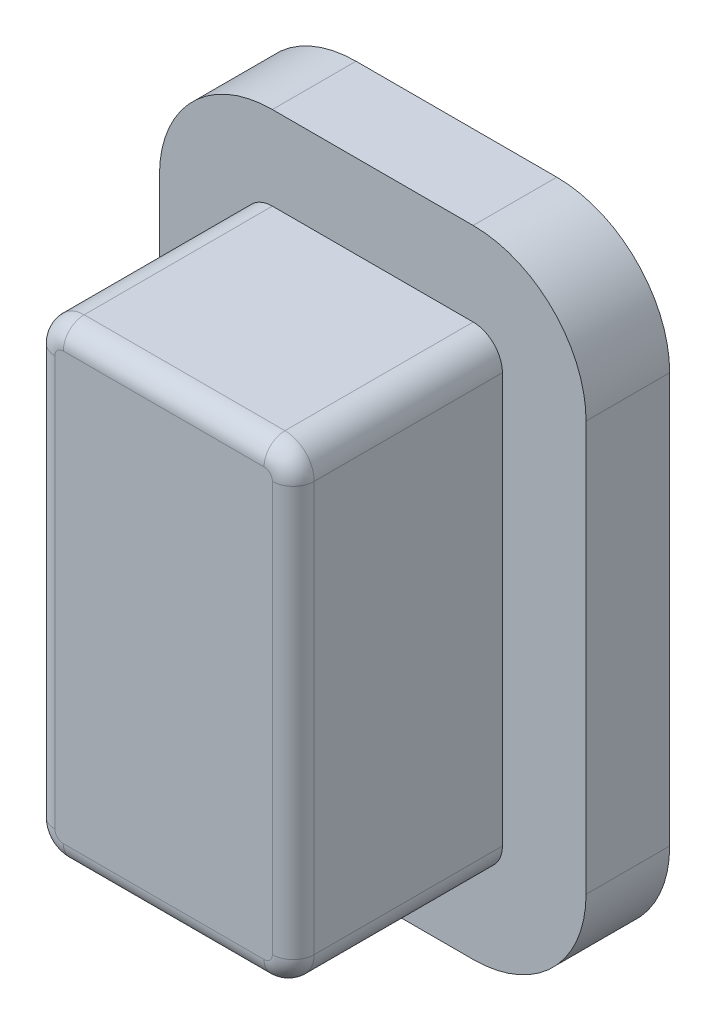
ISO-10303-21;
HEADER;
FILE_DESCRIPTION(('STEP AP214'),'2;1');
FILE_NAME('part.step','',(''),(''),'','','');
FILE_SCHEMA(('AUTOMOTIVE_DESIGN { 1 0 10303 214 1 1 1 1 }'));
ENDSEC;
DATA;
#1=APPLICATION_CONTEXT('core data for automotive mechanical design processes');
#2=APPLICATION_PROTOCOL_DEFINITION('international standard','automotive_design',2000,#1);
#3=PRODUCT_CONTEXT('',#1,'mechanical');
#4=PRODUCT('Part','Part','',(#3));
#5=PRODUCT_RELATED_PRODUCT_CATEGORY('part','',(#4));
#6=PRODUCT_DEFINITION_FORMATION('','',#4);
#7=PRODUCT_DEFINITION_CONTEXT('part definition',#1,'design');
#8=PRODUCT_DEFINITION('design','',#6,#7);
#9=PRODUCT_DEFINITION_SHAPE('','',#8);
#10=(LENGTH_UNIT() NAMED_UNIT(*) SI_UNIT(.MILLI.,.METRE.));
#11=(NAMED_UNIT(*) PLANE_ANGLE_UNIT() SI_UNIT($,.RADIAN.));
#12=(NAMED_UNIT(*) SI_UNIT($,.STERADIAN.) SOLID_ANGLE_UNIT());
#13=UNCERTAINTY_MEASURE_WITH_UNIT(LENGTH_MEASURE(1.E-05),#10,'distance_accuracy_value','');
#14=(GEOMETRIC_REPRESENTATION_CONTEXT(3) GLOBAL_UNCERTAINTY_ASSIGNED_CONTEXT((#13)) GLOBAL_UNIT_ASSIGNED_CONTEXT((#10,
#11,#12)) REPRESENTATION_CONTEXT('',''));
#15=CARTESIAN_POINT('',(0.,0.,0.));
#16=DIRECTION('',(0.,0.,1.));
#17=DIRECTION('',(1.,0.,0.));
#18=AXIS2_PLACEMENT_3D('',#15,#16,#17);
#19=CARTESIAN_POINT('',(2.1,0.,7.));
#20=DIRECTION('',(-1.,0.,0.));
#21=DIRECTION('',(0.,0.,1.));
#22=AXIS2_PLACEMENT_3D('',#19,#20,#21);
#23=PLANE('',#22);
#24=DIRECTION('',(0.,-1.,0.));
#25=VECTOR('',#24,1.);
#26=CARTESIAN_POINT('',(2.1,0.,1.3));
#27=LINE('',#26,#25);
#28=CARTESIAN_POINT('',(2.1,3.5,1.3));
#29=VERTEX_POINT('',#28);
#30=CARTESIAN_POINT('',(2.1,-3.5,1.3));
#31=VERTEX_POINT('',#30);
#32=EDGE_CURVE('E331',#29,#31,#27,.T.);
#33=ORIENTED_EDGE('',*,*,#32,.T.);
#34=DIRECTION('',(0.,0.,-1.));
#35=VECTOR('',#34,1.);
#36=CARTESIAN_POINT('',(2.1,-3.5,7.));
#37=LINE('',#36,#35);
#38=CARTESIAN_POINT('',(2.1,-3.5,0.));
#39=VERTEX_POINT('',#38);
#40=EDGE_CURVE('E346',#31,#39,#37,.T.);
#41=ORIENTED_EDGE('',*,*,#40,.T.);
#42=DIRECTION('',(0.,1.,0.));
#43=VECTOR('',#42,1.);
#44=CARTESIAN_POINT('',(2.1,0.,0.));
#45=LINE('',#44,#43);
#46=CARTESIAN_POINT('',(2.1,-4.6,0.));
#47=VERTEX_POINT('',#46);
#48=EDGE_CURVE('E495',#47,#39,#45,.T.);
#49=ORIENTED_EDGE('',*,*,#48,.F.);
#50=DIRECTION('',(0.,0.,-1.));
#51=VECTOR('',#50,1.);
#52=CARTESIAN_POINT('',(2.1,-4.6,7.));
#53=LINE('',#52,#51);
#54=CARTESIAN_POINT('',(2.1,-4.6,6.));
#55=VERTEX_POINT('',#54);
#56=EDGE_CURVE('E525',#55,#47,#53,.T.);
#57=ORIENTED_EDGE('',*,*,#56,.F.);
#58=DIRECTION('',(0.,-1.,0.));
#59=VECTOR('',#58,1.);
#60=CARTESIAN_POINT('',(2.1,0.,6.));
#61=LINE('',#60,#59);
#62=CARTESIAN_POINT('',(2.1,4.6,6.));
#63=VERTEX_POINT('',#62);
#64=EDGE_CURVE('E368',#63,#55,#61,.T.);
#65=ORIENTED_EDGE('',*,*,#64,.F.);
#66=DIRECTION('',(0.,0.,-1.));
#67=VECTOR('',#66,1.);
#68=CARTESIAN_POINT('',(2.1,4.6,7.));
#69=LINE('',#68,#67);
#70=CARTESIAN_POINT('',(2.1,4.6,0.));
#71=VERTEX_POINT('',#70);
#72=EDGE_CURVE('E508',#63,#71,#69,.T.);
#73=ORIENTED_EDGE('',*,*,#72,.T.);
#74=CARTESIAN_POINT('',(2.1,3.5,0.));
#75=VERTEX_POINT('',#74);
#76=EDGE_CURVE('E491',#75,#71,#45,.T.);
#77=ORIENTED_EDGE('',*,*,#76,.F.);
#78=DIRECTION('',(0.,0.,-1.));
#79=VECTOR('',#78,1.);
#80=CARTESIAN_POINT('',(2.1,3.5,7.));
#81=LINE('',#80,#79);
#82=EDGE_CURVE('E345',#29,#75,#81,.T.);
#83=ORIENTED_EDGE('',*,*,#82,.F.);
#84=EDGE_LOOP('',(#33,#41,#49,#57,#65,#73,#77,#83));
#85=FACE_BOUND('',#84,.T.);
#86=ADVANCED_FACE('F63',(#85),#23,.T.);
#87=CARTESIAN_POINT('',(-2.1,0.,7.));
#88=DIRECTION('',(-1.,0.,0.));
#89=DIRECTION('',(0.,0.,1.));
#90=AXIS2_PLACEMENT_3D('',#87,#88,#89);
#91=PLANE('',#90);
#92=DIRECTION('',(0.,0.,-1.));
#93=VECTOR('',#92,1.);
#94=CARTESIAN_POINT('',(-2.1,-3.5,7.));
#95=LINE('',#94,#93);
#96=CARTESIAN_POINT('',(-2.1,-3.5,1.3));
#97=VERTEX_POINT('',#96);
#98=CARTESIAN_POINT('',(-2.1,-3.5,0.));
#99=VERTEX_POINT('',#98);
#100=EDGE_CURVE('E343',#97,#99,#95,.T.);
#101=ORIENTED_EDGE('',*,*,#100,.F.);
#102=DIRECTION('',(0.,-1.,0.));
#103=VECTOR('',#102,1.);
#104=CARTESIAN_POINT('',(-2.1,0.,1.3));
#105=LINE('',#104,#103);
#106=CARTESIAN_POINT('',(-2.1,3.5,1.3));
#107=VERTEX_POINT('',#106);
#108=EDGE_CURVE('E297',#107,#97,#105,.T.);
#109=ORIENTED_EDGE('',*,*,#108,.F.);
#110=DIRECTION('',(0.,0.,-1.));
#111=VECTOR('',#110,1.);
#112=CARTESIAN_POINT('',(-2.1,3.5,7.));
#113=LINE('',#112,#111);
#114=CARTESIAN_POINT('',(-2.1,3.5,0.));
#115=VERTEX_POINT('',#114);
#116=EDGE_CURVE('E337',#107,#115,#113,.T.);
#117=ORIENTED_EDGE('',*,*,#116,.T.);
#118=DIRECTION('',(0.,1.,0.));
#119=VECTOR('',#118,1.);
#120=CARTESIAN_POINT('',(-2.1,0.,0.));
#121=LINE('',#120,#119);
#122=CARTESIAN_POINT('',(-2.1,4.6,0.));
#123=VERTEX_POINT('',#122);
#124=EDGE_CURVE('E498',#115,#123,#121,.T.);
#125=ORIENTED_EDGE('',*,*,#124,.T.);
#126=DIRECTION('',(0.,0.,-1.));
#127=VECTOR('',#126,1.);
#128=CARTESIAN_POINT('',(-2.1,4.6,7.));
#129=LINE('',#128,#127);
#130=CARTESIAN_POINT('',(-2.1,4.6,6.));
#131=VERTEX_POINT('',#130);
#132=EDGE_CURVE('E514',#131,#123,#129,.T.);
#133=ORIENTED_EDGE('',*,*,#132,.F.);
#134=DIRECTION('',(0.,-1.,0.));
#135=VECTOR('',#134,1.);
#136=CARTESIAN_POINT('',(-2.1,0.,6.));
#137=LINE('',#136,#135);
#138=CARTESIAN_POINT('',(-2.1,-4.6,6.));
#139=VERTEX_POINT('',#138);
#140=EDGE_CURVE('E358',#131,#139,#137,.T.);
#141=ORIENTED_EDGE('',*,*,#140,.T.);
#142=DIRECTION('',(0.,0.,-1.));
#143=VECTOR('',#142,1.);
#144=CARTESIAN_POINT('',(-2.1,-4.6,7.));
#145=LINE('',#144,#143);
#146=CARTESIAN_POINT('',(-2.1,-4.6,0.));
#147=VERTEX_POINT('',#146);
#148=EDGE_CURVE('E520',#139,#147,#145,.T.);
#149=ORIENTED_EDGE('',*,*,#148,.T.);
#150=EDGE_CURVE('E503',#147,#99,#121,.T.);
#151=ORIENTED_EDGE('',*,*,#150,.T.);
#152=EDGE_LOOP('',(#101,#109,#117,#125,#133,#141,#149,#151));
#153=FACE_BOUND('',#152,.T.);
#154=ADVANCED_FACE('F656',(#153),#91,.F.);
#155=CARTESIAN_POINT('',(0.,-4.6,7.));
#156=DIRECTION('',(0.,-1.,0.));
#157=DIRECTION('',(0.,0.,-1.));
#158=AXIS2_PLACEMENT_3D('',#155,#156,#157);
#159=PLANE('',#158);
#160=ORIENTED_EDGE('',*,*,#148,.F.);
#161=DIRECTION('',(1.,0.,0.));
#162=VECTOR('',#161,1.);
#163=CARTESIAN_POINT('',(0.,-4.6,6.));
#164=LINE('',#163,#162);
#165=EDGE_CURVE('E361',#139,#55,#164,.T.);
#166=ORIENTED_EDGE('',*,*,#165,.T.);
#167=ORIENTED_EDGE('',*,*,#56,.T.);
#168=DIRECTION('',(-1.,0.,0.));
#169=VECTOR('',#168,1.);
#170=CARTESIAN_POINT('',(0.,-4.6,0.));
#171=LINE('',#170,#169);
#172=EDGE_CURVE('E497',#47,#147,#171,.T.);
#173=ORIENTED_EDGE('',*,*,#172,.T.);
#174=EDGE_LOOP('',(#160,#166,#167,#173));
#175=FACE_BOUND('',#174,.T.);
#176=ADVANCED_FACE('F670',(#175),#159,.F.);
#177=CARTESIAN_POINT('',(-2.4,-4.9,7.));
#178=DIRECTION('',(0.,0.,-1.));
#179=DIRECTION('',(-1.,0.,0.));
#180=AXIS2_PLACEMENT_3D('',#177,#178,#179);
#181=CYLINDRICAL_SURFACE('',#180,0.7);
#182=DIRECTION('',(0.,0.,-1.));
#183=VECTOR('',#182,1.);
#184=CARTESIAN_POINT('',(-2.4,-5.6,7.));
#185=LINE('',#184,#183);
#186=CARTESIAN_POINT('',(-2.4,-5.6,6.5));
#187=VERTEX_POINT('',#186);
#188=CARTESIAN_POINT('',(-2.4,-5.6,2.));
#189=VERTEX_POINT('',#188);
#190=EDGE_CURVE('E513',#187,#189,#185,.T.);
#191=ORIENTED_EDGE('',*,*,#190,.F.);
#192=CARTESIAN_POINT('',(-2.4,-4.9,6.5));
#193=DIRECTION('',(0.,0.,1.));
#194=DIRECTION('',(1.,0.,0.));
#195=AXIS2_PLACEMENT_3D('',#192,#193,#194);
#196=CIRCLE('',#195,0.7);
#197=CARTESIAN_POINT('',(-3.1,-4.9,6.5));
#198=VERTEX_POINT('',#197);
#199=EDGE_CURVE('E12',#187,#198,#196,.F.);
#200=ORIENTED_EDGE('',*,*,#199,.T.);
#201=DIRECTION('',(0.,0.,-1.));
#202=VECTOR('',#201,1.);
#203=CARTESIAN_POINT('',(-3.1,-4.9,7.));
#204=LINE('',#203,#202);
#205=CARTESIAN_POINT('',(-3.1,-4.9,2.));
#206=VERTEX_POINT('',#205);
#207=EDGE_CURVE('E506',#198,#206,#204,.T.);
#208=ORIENTED_EDGE('',*,*,#207,.T.);
#209=CARTESIAN_POINT('',(-2.4,-4.9,2.));
#210=DIRECTION('',(0.,0.,1.));
#211=DIRECTION('',(1.,0.,0.));
#212=AXIS2_PLACEMENT_3D('',#209,#210,#211);
#213=CIRCLE('',#212,0.7);
#214=EDGE_CURVE('E410',#189,#206,#213,.F.);
#215=ORIENTED_EDGE('',*,*,#214,.F.);
#216=EDGE_LOOP('',(#191,#200,#208,#215));
#217=FACE_BOUND('',#216,.T.);
#218=ADVANCED_FACE('F716',(#217),#181,.T.);
#219=CARTESIAN_POINT('',(0.,-5.6,7.));
#220=DIRECTION('',(0.,-1.,0.));
#221=DIRECTION('',(1.,0.,0.));
#222=AXIS2_PLACEMENT_3D('',#219,#220,#221);
#223=PLANE('',#222);
#224=DIRECTION('',(0.,0.,-1.));
#225=VECTOR('',#224,1.);
#226=CARTESIAN_POINT('',(2.4,-5.6,7.));
#227=LINE('',#226,#225);
#228=CARTESIAN_POINT('',(2.4,-5.6,6.5));
#229=VERTEX_POINT('',#228);
#230=CARTESIAN_POINT('',(2.4,-5.6,2.));
#231=VERTEX_POINT('',#230);
#232=EDGE_CURVE('E543',#229,#231,#227,.T.);
#233=ORIENTED_EDGE('',*,*,#232,.F.);
#234=DIRECTION('',(-1.,0.,0.));
#235=VECTOR('',#234,1.);
#236=CARTESIAN_POINT('',(0.,-5.6,6.5));
#237=LINE('',#236,#235);
#238=EDGE_CURVE('E72',#229,#187,#237,.T.);
#239=ORIENTED_EDGE('',*,*,#238,.T.);
#240=ORIENTED_EDGE('',*,*,#190,.T.);
#241=DIRECTION('',(-1.,0.,0.));
#242=VECTOR('',#241,1.);
#243=CARTESIAN_POINT('',(0.,-5.6,2.));
#244=LINE('',#243,#242);
#245=EDGE_CURVE('E403',#231,#189,#244,.T.);
#246=ORIENTED_EDGE('',*,*,#245,.F.);
#247=EDGE_LOOP('',(#233,#239,#240,#246));
#248=FACE_BOUND('',#247,.T.);
#249=ADVANCED_FACE('F717',(#248),#223,.T.);
#250=CARTESIAN_POINT('',(2.4,-4.9,7.));
#251=DIRECTION('',(0.,0.,-1.));
#252=DIRECTION('',(-1.,0.,0.));
#253=AXIS2_PLACEMENT_3D('',#250,#251,#252);
#254=CYLINDRICAL_SURFACE('',#253,0.700000000000001);
#255=DIRECTION('',(0.,0.,-1.));
#256=VECTOR('',#255,1.);
#257=CARTESIAN_POINT('',(3.1,-4.9,7.));
#258=LINE('',#257,#256);
#259=CARTESIAN_POINT('',(3.1,-4.9,6.5));
#260=VERTEX_POINT('',#259);
#261=CARTESIAN_POINT('',(3.1,-4.9,2.));
#262=VERTEX_POINT('',#261);
#263=EDGE_CURVE('E539',#260,#262,#258,.T.);
#264=ORIENTED_EDGE('',*,*,#263,.F.);
#265=CARTESIAN_POINT('',(2.4,-4.9,6.5));
#266=DIRECTION('',(0.,0.,1.));
#267=DIRECTION('',(1.,0.,0.));
#268=AXIS2_PLACEMENT_3D('',#265,#266,#267);
#269=CIRCLE('',#268,0.700000000000001);
#270=EDGE_CURVE('E88',#260,#229,#269,.F.);
#271=ORIENTED_EDGE('',*,*,#270,.T.);
#272=ORIENTED_EDGE('',*,*,#232,.T.);
#273=CARTESIAN_POINT('',(2.4,-4.9,2.));
#274=DIRECTION('',(0.,0.,1.));
#275=DIRECTION('',(1.,0.,0.));
#276=AXIS2_PLACEMENT_3D('',#273,#274,#275);
#277=CIRCLE('',#276,0.700000000000001);
#278=EDGE_CURVE('E433',#262,#231,#277,.F.);
#279=ORIENTED_EDGE('',*,*,#278,.F.);
#280=EDGE_LOOP('',(#264,#271,#272,#279));
#281=FACE_BOUND('',#280,.T.);
#282=ADVANCED_FACE('F715',(#281),#254,.T.);
#283=CARTESIAN_POINT('',(3.1,0.,7.));
#284=DIRECTION('',(-1.,0.,0.));
#285=DIRECTION('',(0.,0.,1.));
#286=AXIS2_PLACEMENT_3D('',#283,#284,#285);
#287=PLANE('',#286);
#288=DIRECTION('',(0.,0.,-1.));
#289=VECTOR('',#288,1.);
#290=CARTESIAN_POINT('',(3.1,4.9,7.));
#291=LINE('',#290,#289);
#292=CARTESIAN_POINT('',(3.1,4.9,6.5));
#293=VERTEX_POINT('',#292);
#294=CARTESIAN_POINT('',(3.1,4.9,2.));
#295=VERTEX_POINT('',#294);
#296=EDGE_CURVE('E540',#293,#295,#291,.T.);
#297=ORIENTED_EDGE('',*,*,#296,.F.);
#298=DIRECTION('',(0.,1.,0.));
#299=VECTOR('',#298,1.);
#300=CARTESIAN_POINT('',(3.1,-4.9,6.5));
#301=LINE('',#300,#299);
#302=EDGE_CURVE('E584',#293,#260,#301,.F.);
#303=ORIENTED_EDGE('',*,*,#302,.T.);
#304=ORIENTED_EDGE('',*,*,#263,.T.);
#305=DIRECTION('',(0.,1.,0.));
#306=VECTOR('',#305,1.);
#307=CARTESIAN_POINT('',(3.1,0.,2.));
#308=LINE('',#307,#306);
#309=EDGE_CURVE('E427',#262,#295,#308,.T.);
#310=ORIENTED_EDGE('',*,*,#309,.T.);
#311=EDGE_LOOP('',(#297,#303,#304,#310));
#312=FACE_BOUND('',#311,.T.);
#313=ADVANCED_FACE('F708',(#312),#287,.F.);
#314=CARTESIAN_POINT('',(2.4,4.9,7.));
#315=DIRECTION('',(0.,0.,-1.));
#316=DIRECTION('',(-1.,0.,0.));
#317=AXIS2_PLACEMENT_3D('',#314,#315,#316);
#318=CYLINDRICAL_SURFACE('',#317,0.700000000000001);
#319=DIRECTION('',(0.,0.,-1.));
#320=VECTOR('',#319,1.);
#321=CARTESIAN_POINT('',(2.4,5.6,7.));
#322=LINE('',#321,#320);
#323=CARTESIAN_POINT('',(2.4,5.6,6.5));
#324=VERTEX_POINT('',#323);
#325=CARTESIAN_POINT('',(2.4,5.6,2.));
#326=VERTEX_POINT('',#325);
#327=EDGE_CURVE('E534',#324,#326,#322,.T.);
#328=ORIENTED_EDGE('',*,*,#327,.F.);
#329=CARTESIAN_POINT('',(2.4,4.9,6.5));
#330=DIRECTION('',(0.,0.,1.));
#331=DIRECTION('',(1.,0.,0.));
#332=AXIS2_PLACEMENT_3D('',#329,#330,#331);
#333=CIRCLE('',#332,0.700000000000001);
#334=EDGE_CURVE('E582',#324,#293,#333,.F.);
#335=ORIENTED_EDGE('',*,*,#334,.T.);
#336=ORIENTED_EDGE('',*,*,#296,.T.);
#337=CARTESIAN_POINT('',(2.4,4.9,2.));
#338=DIRECTION('',(0.,0.,1.));
#339=DIRECTION('',(1.,0.,0.));
#340=AXIS2_PLACEMENT_3D('',#337,#338,#339);
#341=CIRCLE('',#340,0.700000000000001);
#342=EDGE_CURVE('E422',#295,#326,#341,.T.);
#343=ORIENTED_EDGE('',*,*,#342,.T.);
#344=EDGE_LOOP('',(#328,#335,#336,#343));
#345=FACE_BOUND('',#344,.T.);
#346=ADVANCED_FACE('F702',(#345),#318,.T.);
#347=CARTESIAN_POINT('',(0.,5.6,7.));
#348=DIRECTION('',(0.,-1.,0.));
#349=DIRECTION('',(1.,0.,0.));
#350=AXIS2_PLACEMENT_3D('',#347,#348,#349);
#351=PLANE('',#350);
#352=DIRECTION('',(0.,0.,-1.));
#353=VECTOR('',#352,1.);
#354=CARTESIAN_POINT('',(-2.4,5.6,7.));
#355=LINE('',#354,#353);
#356=CARTESIAN_POINT('',(-2.4,5.6,6.5));
#357=VERTEX_POINT('',#356);
#358=CARTESIAN_POINT('',(-2.4,5.6,2.));
#359=VERTEX_POINT('',#358);
#360=EDGE_CURVE('E533',#357,#359,#355,.T.);
#361=ORIENTED_EDGE('',*,*,#360,.F.);
#362=DIRECTION('',(-1.,0.,0.));
#363=VECTOR('',#362,1.);
#364=CARTESIAN_POINT('',(2.4,5.6,6.5));
#365=LINE('',#364,#363);
#366=EDGE_CURVE('E576',#357,#324,#365,.F.);
#367=ORIENTED_EDGE('',*,*,#366,.T.);
#368=ORIENTED_EDGE('',*,*,#327,.T.);
#369=DIRECTION('',(-1.,0.,0.));
#370=VECTOR('',#369,1.);
#371=CARTESIAN_POINT('',(0.,5.6,2.));
#372=LINE('',#371,#370);
#373=EDGE_CURVE('E423',#326,#359,#372,.T.);
#374=ORIENTED_EDGE('',*,*,#373,.T.);
#375=EDGE_LOOP('',(#361,#367,#368,#374));
#376=FACE_BOUND('',#375,.T.);
#377=ADVANCED_FACE('F697',(#376),#351,.F.);
#378=CARTESIAN_POINT('',(-2.4,4.9,7.));
#379=DIRECTION('',(0.,0.,-1.));
#380=DIRECTION('',(-1.,0.,0.));
#381=AXIS2_PLACEMENT_3D('',#378,#379,#380);
#382=CYLINDRICAL_SURFACE('',#381,0.700000000000001);
#383=DIRECTION('',(0.,0.,-1.));
#384=VECTOR('',#383,1.);
#385=CARTESIAN_POINT('',(-3.1,4.9,7.));
#386=LINE('',#385,#384);
#387=CARTESIAN_POINT('',(-3.1,4.9,6.5));
#388=VERTEX_POINT('',#387);
#389=CARTESIAN_POINT('',(-3.1,4.9,2.));
#390=VERTEX_POINT('',#389);
#391=EDGE_CURVE('E526',#388,#390,#386,.T.);
#392=ORIENTED_EDGE('',*,*,#391,.F.);
#393=CARTESIAN_POINT('',(-2.4,4.9,6.5));
#394=DIRECTION('',(0.,0.,1.));
#395=DIRECTION('',(1.,0.,0.));
#396=AXIS2_PLACEMENT_3D('',#393,#394,#395);
#397=CIRCLE('',#396,0.700000000000001);
#398=EDGE_CURVE('E577',#388,#357,#397,.F.);
#399=ORIENTED_EDGE('',*,*,#398,.T.);
#400=ORIENTED_EDGE('',*,*,#360,.T.);
#401=CARTESIAN_POINT('',(-2.4,4.9,2.));
#402=DIRECTION('',(0.,0.,1.));
#403=DIRECTION('',(1.,0.,0.));
#404=AXIS2_PLACEMENT_3D('',#401,#402,#403);
#405=CIRCLE('',#404,0.700000000000001);
#406=EDGE_CURVE('E417',#390,#359,#405,.F.);
#407=ORIENTED_EDGE('',*,*,#406,.F.);
#408=EDGE_LOOP('',(#392,#399,#400,#407));
#409=FACE_BOUND('',#408,.T.);
#410=ADVANCED_FACE('F698',(#409),#382,.T.);
#411=CARTESIAN_POINT('',(-3.1,0.,7.));
#412=DIRECTION('',(-1.,0.,0.));
#413=DIRECTION('',(0.,0.,1.));
#414=AXIS2_PLACEMENT_3D('',#411,#412,#413);
#415=PLANE('',#414);
#416=ORIENTED_EDGE('',*,*,#207,.F.);
#417=DIRECTION('',(0.,1.,0.));
#418=VECTOR('',#417,1.);
#419=CARTESIAN_POINT('',(-3.1,0.,6.5));
#420=LINE('',#419,#418);
#421=EDGE_CURVE('E523',#198,#388,#420,.T.);
#422=ORIENTED_EDGE('',*,*,#421,.T.);
#423=ORIENTED_EDGE('',*,*,#391,.T.);
#424=DIRECTION('',(0.,1.,0.));
#425=VECTOR('',#424,1.);
#426=CARTESIAN_POINT('',(-3.1,0.,2.));
#427=LINE('',#426,#425);
#428=EDGE_CURVE('E414',#206,#390,#427,.T.);
#429=ORIENTED_EDGE('',*,*,#428,.F.);
#430=EDGE_LOOP('',(#416,#422,#423,#429));
#431=FACE_BOUND('',#430,.T.);
#432=ADVANCED_FACE('F691',(#431),#415,.T.);
#433=CARTESIAN_POINT('',(0.,4.6,7.));
#434=DIRECTION('',(0.,-1.,0.));
#435=DIRECTION('',(1.,0.,0.));
#436=AXIS2_PLACEMENT_3D('',#433,#434,#435);
#437=PLANE('',#436);
#438=DIRECTION('',(1.,0.,0.));
#439=VECTOR('',#438,1.);
#440=CARTESIAN_POINT('',(0.,4.6,6.));
#441=LINE('',#440,#439);
#442=EDGE_CURVE('E367',#131,#63,#441,.T.);
#443=ORIENTED_EDGE('',*,*,#442,.F.);
#444=ORIENTED_EDGE('',*,*,#132,.T.);
#445=DIRECTION('',(-1.,0.,0.));
#446=VECTOR('',#445,1.);
#447=CARTESIAN_POINT('',(0.,4.6,0.));
#448=LINE('',#447,#446);
#449=EDGE_CURVE('E501',#71,#123,#448,.T.);
#450=ORIENTED_EDGE('',*,*,#449,.F.);
#451=ORIENTED_EDGE('',*,*,#72,.F.);
#452=EDGE_LOOP('',(#443,#444,#450,#451));
#453=FACE_BOUND('',#452,.T.);
#454=ADVANCED_FACE('F662',(#453),#437,.T.);
#455=CARTESIAN_POINT('',(0.,0.,7.));
#456=DIRECTION('',(0.,0.,1.));
#457=DIRECTION('',(1.,0.,0.));
#458=AXIS2_PLACEMENT_3D('',#455,#456,#457);
#459=PLANE('',#458);
#460=CARTESIAN_POINT('',(-2.4,4.9,7.));
#461=DIRECTION('',(0.,0.,1.));
#462=DIRECTION('',(1.,0.,0.));
#463=AXIS2_PLACEMENT_3D('',#460,#461,#462);
#464=CIRCLE('',#463,0.200000000000001);
#465=CARTESIAN_POINT('',(-2.4,5.1,7.));
#466=VERTEX_POINT('',#465);
#467=CARTESIAN_POINT('',(-2.6,4.9,7.));
#468=VERTEX_POINT('',#467);
#469=EDGE_CURVE('E569',#466,#468,#464,.T.);
#470=ORIENTED_EDGE('',*,*,#469,.T.);
#471=DIRECTION('',(0.,1.,0.));
#472=VECTOR('',#471,1.);
#473=CARTESIAN_POINT('',(-2.6,0.,7.));
#474=LINE('',#473,#472);
#475=CARTESIAN_POINT('',(-2.6,-4.9,7.));
#476=VERTEX_POINT('',#475);
#477=EDGE_CURVE('E574',#468,#476,#474,.F.);
#478=ORIENTED_EDGE('',*,*,#477,.T.);
#479=CARTESIAN_POINT('',(-2.4,-4.9,7.));
#480=DIRECTION('',(0.,0.,1.));
#481=DIRECTION('',(1.,0.,0.));
#482=AXIS2_PLACEMENT_3D('',#479,#480,#481);
#483=CIRCLE('',#482,0.2);
#484=CARTESIAN_POINT('',(-2.4,-5.1,7.));
#485=VERTEX_POINT('',#484);
#486=EDGE_CURVE('E552',#476,#485,#483,.T.);
#487=ORIENTED_EDGE('',*,*,#486,.T.);
#488=DIRECTION('',(-1.,0.,0.));
#489=VECTOR('',#488,1.);
#490=CARTESIAN_POINT('',(0.,-5.1,7.));
#491=LINE('',#490,#489);
#492=CARTESIAN_POINT('',(2.4,-5.1,7.));
#493=VERTEX_POINT('',#492);
#494=EDGE_CURVE('E551',#485,#493,#491,.F.);
#495=ORIENTED_EDGE('',*,*,#494,.T.);
#496=CARTESIAN_POINT('',(2.4,-4.9,7.));
#497=DIRECTION('',(0.,0.,1.));
#498=DIRECTION('',(1.,0.,0.));
#499=AXIS2_PLACEMENT_3D('',#496,#497,#498);
#500=CIRCLE('',#499,0.200000000000001);
#501=CARTESIAN_POINT('',(2.6,-4.9,7.));
#502=VERTEX_POINT('',#501);
#503=EDGE_CURVE('E559',#493,#502,#500,.T.);
#504=ORIENTED_EDGE('',*,*,#503,.T.);
#505=DIRECTION('',(0.,1.,0.));
#506=VECTOR('',#505,1.);
#507=CARTESIAN_POINT('',(2.6,4.9,7.));
#508=LINE('',#507,#506);
#509=CARTESIAN_POINT('',(2.6,4.9,7.));
#510=VERTEX_POINT('',#509);
#511=EDGE_CURVE('E556',#502,#510,#508,.T.);
#512=ORIENTED_EDGE('',*,*,#511,.T.);
#513=CARTESIAN_POINT('',(2.4,4.9,7.));
#514=DIRECTION('',(0.,0.,1.));
#515=DIRECTION('',(1.,0.,0.));
#516=AXIS2_PLACEMENT_3D('',#513,#514,#515);
#517=CIRCLE('',#516,0.200000000000001);
#518=CARTESIAN_POINT('',(2.4,5.1,7.));
#519=VERTEX_POINT('',#518);
#520=EDGE_CURVE('E564',#510,#519,#517,.T.);
#521=ORIENTED_EDGE('',*,*,#520,.T.);
#522=DIRECTION('',(-1.,0.,0.));
#523=VECTOR('',#522,1.);
#524=CARTESIAN_POINT('',(-2.4,5.1,7.));
#525=LINE('',#524,#523);
#526=EDGE_CURVE('E567',#519,#466,#525,.T.);
#527=ORIENTED_EDGE('',*,*,#526,.T.);
#528=EDGE_LOOP('',(#470,#478,#487,#495,#504,#512,#521,#527));
#529=FACE_BOUND('',#528,.T.);
#530=ADVANCED_FACE('F759',(#529),#459,.T.);
#531=CARTESIAN_POINT('',(0.,0.,0.));
#532=DIRECTION('',(0.,0.,1.));
#533=DIRECTION('',(1.,0.,0.));
#534=AXIS2_PLACEMENT_3D('',#531,#532,#533);
#535=PLANE('',#534);
#536=DIRECTION('',(0.,-1.,0.));
#537=VECTOR('',#536,1.);
#538=CARTESIAN_POINT('',(-3.5,0.,0.));
#539=LINE('',#538,#537);
#540=CARTESIAN_POINT('',(-3.5,3.5,0.));
#541=VERTEX_POINT('',#540);
#542=CARTESIAN_POINT('',(-3.5,-3.5,0.));
#543=VERTEX_POINT('',#542);
#544=EDGE_CURVE('E311',#541,#543,#539,.T.);
#545=ORIENTED_EDGE('',*,*,#544,.T.);
#546=DIRECTION('',(1.,0.,0.));
#547=VECTOR('',#546,1.);
#548=CARTESIAN_POINT('',(0.,-3.5,0.));
#549=LINE('',#548,#547);
#550=EDGE_CURVE('E295',#543,#99,#549,.T.);
#551=ORIENTED_EDGE('',*,*,#550,.T.);
#552=ORIENTED_EDGE('',*,*,#150,.F.);
#553=ORIENTED_EDGE('',*,*,#172,.F.);
#554=ORIENTED_EDGE('',*,*,#48,.T.);
#555=CARTESIAN_POINT('',(3.5,-3.5,0.));
#556=VERTEX_POINT('',#555);
#557=EDGE_CURVE('E314',#39,#556,#549,.T.);
#558=ORIENTED_EDGE('',*,*,#557,.T.);
#559=DIRECTION('',(0.,-1.,0.));
#560=VECTOR('',#559,1.);
#561=CARTESIAN_POINT('',(3.5,0.,0.));
#562=LINE('',#561,#560);
#563=CARTESIAN_POINT('',(3.5,3.5,0.));
#564=VERTEX_POINT('',#563);
#565=EDGE_CURVE('E304',#564,#556,#562,.T.);
#566=ORIENTED_EDGE('',*,*,#565,.F.);
#567=DIRECTION('',(1.,0.,0.));
#568=VECTOR('',#567,1.);
#569=CARTESIAN_POINT('',(0.,3.5,0.));
#570=LINE('',#569,#568);
#571=EDGE_CURVE('E320',#75,#564,#570,.T.);
#572=ORIENTED_EDGE('',*,*,#571,.F.);
#573=ORIENTED_EDGE('',*,*,#76,.T.);
#574=ORIENTED_EDGE('',*,*,#449,.T.);
#575=ORIENTED_EDGE('',*,*,#124,.F.);
#576=EDGE_CURVE('E318',#541,#115,#570,.T.);
#577=ORIENTED_EDGE('',*,*,#576,.F.);
#578=EDGE_LOOP('',(#545,#551,#552,#553,#554,#558,#566,#572,#573,#574,#575,#577));
#579=FACE_BOUND('',#578,.T.);
#580=CARTESIAN_POINT('',(2.4,-4.9,0.));
#581=DIRECTION('',(0.,0.,1.));
#582=DIRECTION('',(1.,0.,0.));
#583=AXIS2_PLACEMENT_3D('',#580,#581,#582);
#584=CIRCLE('',#583,2.7);
#585=CARTESIAN_POINT('',(5.1,-4.9,0.));
#586=VERTEX_POINT('',#585);
#587=CARTESIAN_POINT('',(2.4,-7.6,0.));
#588=VERTEX_POINT('',#587);
#589=EDGE_CURVE('E372',#586,#588,#584,.F.);
#590=ORIENTED_EDGE('',*,*,#589,.T.);
#591=DIRECTION('',(-1.,0.,0.));
#592=VECTOR('',#591,1.);
#593=CARTESIAN_POINT('',(0.,-7.6,0.));
#594=LINE('',#593,#592);
#595=CARTESIAN_POINT('',(-2.4,-7.6,0.));
#596=VERTEX_POINT('',#595);
#597=EDGE_CURVE('E379',#588,#596,#594,.T.);
#598=ORIENTED_EDGE('',*,*,#597,.T.);
#599=CARTESIAN_POINT('',(-2.4,-4.9,0.));
#600=DIRECTION('',(0.,0.,1.));
#601=DIRECTION('',(1.,0.,0.));
#602=AXIS2_PLACEMENT_3D('',#599,#600,#601);
#603=CIRCLE('',#602,2.7);
#604=CARTESIAN_POINT('',(-5.1,-4.9,0.));
#605=VERTEX_POINT('',#604);
#606=EDGE_CURVE('E459',#596,#605,#603,.F.);
#607=ORIENTED_EDGE('',*,*,#606,.T.);
#608=DIRECTION('',(0.,1.,0.));
#609=VECTOR('',#608,1.);
#610=CARTESIAN_POINT('',(-5.1,0.,0.));
#611=LINE('',#610,#609);
#612=CARTESIAN_POINT('',(-5.1,4.9,0.));
#613=VERTEX_POINT('',#612);
#614=EDGE_CURVE('E453',#605,#613,#611,.T.);
#615=ORIENTED_EDGE('',*,*,#614,.T.);
#616=CARTESIAN_POINT('',(-2.4,4.9,0.));
#617=DIRECTION('',(0.,0.,1.));
#618=DIRECTION('',(1.,0.,0.));
#619=AXIS2_PLACEMENT_3D('',#616,#617,#618);
#620=CIRCLE('',#619,2.7);
#621=CARTESIAN_POINT('',(-2.4,7.6,0.));
#622=VERTEX_POINT('',#621);
#623=EDGE_CURVE('E452',#613,#622,#620,.F.);
#624=ORIENTED_EDGE('',*,*,#623,.T.);
#625=DIRECTION('',(-1.,0.,0.));
#626=VECTOR('',#625,1.);
#627=CARTESIAN_POINT('',(0.,7.6,0.));
#628=LINE('',#627,#626);
#629=CARTESIAN_POINT('',(2.4,7.6,0.));
#630=VERTEX_POINT('',#629);
#631=EDGE_CURVE('E449',#630,#622,#628,.T.);
#632=ORIENTED_EDGE('',*,*,#631,.F.);
#633=CARTESIAN_POINT('',(2.4,4.9,0.));
#634=DIRECTION('',(0.,0.,1.));
#635=DIRECTION('',(1.,0.,0.));
#636=AXIS2_PLACEMENT_3D('',#633,#634,#635);
#637=CIRCLE('',#636,2.7);
#638=CARTESIAN_POINT('',(5.1,4.9,0.));
#639=VERTEX_POINT('',#638);
#640=EDGE_CURVE('E441',#639,#630,#637,.T.);
#641=ORIENTED_EDGE('',*,*,#640,.F.);
#642=DIRECTION('',(0.,1.,0.));
#643=VECTOR('',#642,1.);
#644=CARTESIAN_POINT('',(5.1,0.,0.));
#645=LINE('',#644,#643);
#646=EDGE_CURVE('E442',#586,#639,#645,.T.);
#647=ORIENTED_EDGE('',*,*,#646,.F.);
#648=EDGE_LOOP('',(#590,#598,#607,#615,#624,#632,#641,#647));
#649=FACE_BOUND('',#648,.T.);
#650=ADVANCED_FACE('F630',(#579,#649),#535,.F.);
#651=CARTESIAN_POINT('',(2.4,-4.9,2.));
#652=DIRECTION('',(0.,0.,-1.));
#653=DIRECTION('',(-1.,0.,0.));
#654=AXIS2_PLACEMENT_3D('',#651,#652,#653);
#655=CYLINDRICAL_SURFACE('',#654,2.7);
#656=ORIENTED_EDGE('',*,*,#589,.F.);
#657=DIRECTION('',(0.,0.,-1.));
#658=VECTOR('',#657,1.);
#659=CARTESIAN_POINT('',(5.1,-4.9,2.));
#660=LINE('',#659,#658);
#661=CARTESIAN_POINT('',(5.1,-4.9,2.));
#662=VERTEX_POINT('',#661);
#663=EDGE_CURVE('E488',#662,#586,#660,.T.);
#664=ORIENTED_EDGE('',*,*,#663,.F.);
#665=CARTESIAN_POINT('',(2.4,-4.9,2.));
#666=DIRECTION('',(0.,0.,1.));
#667=DIRECTION('',(1.,0.,0.));
#668=AXIS2_PLACEMENT_3D('',#665,#666,#667);
#669=CIRCLE('',#668,2.7);
#670=CARTESIAN_POINT('',(2.4,-7.6,2.));
#671=VERTEX_POINT('',#670);
#672=EDGE_CURVE('E374',#662,#671,#669,.F.);
#673=ORIENTED_EDGE('',*,*,#672,.T.);
#674=DIRECTION('',(0.,0.,-1.));
#675=VECTOR('',#674,1.);
#676=CARTESIAN_POINT('',(2.4,-7.6,2.));
#677=LINE('',#676,#675);
#678=EDGE_CURVE('E440',#671,#588,#677,.T.);
#679=ORIENTED_EDGE('',*,*,#678,.T.);
#680=EDGE_LOOP('',(#656,#664,#673,#679));
#681=FACE_BOUND('',#680,.T.);
#682=ADVANCED_FACE('F826',(#681),#655,.T.);
#683=CARTESIAN_POINT('',(5.1,0.,2.));
#684=DIRECTION('',(-1.,0.,0.));
#685=DIRECTION('',(0.,-1.,0.));
#686=AXIS2_PLACEMENT_3D('',#683,#684,#685);
#687=PLANE('',#686);
#688=ORIENTED_EDGE('',*,*,#646,.T.);
#689=DIRECTION('',(0.,0.,-1.));
#690=VECTOR('',#689,1.);
#691=CARTESIAN_POINT('',(5.1,4.9,2.));
#692=LINE('',#691,#690);
#693=CARTESIAN_POINT('',(5.1,4.9,2.));
#694=VERTEX_POINT('',#693);
#695=EDGE_CURVE('E482',#694,#639,#692,.T.);
#696=ORIENTED_EDGE('',*,*,#695,.F.);
#697=DIRECTION('',(0.,1.,0.));
#698=VECTOR('',#697,1.);
#699=CARTESIAN_POINT('',(5.1,0.,2.));
#700=LINE('',#699,#698);
#701=EDGE_CURVE('E377',#662,#694,#700,.T.);
#702=ORIENTED_EDGE('',*,*,#701,.F.);
#703=ORIENTED_EDGE('',*,*,#663,.T.);
#704=EDGE_LOOP('',(#688,#696,#702,#703));
#705=FACE_BOUND('',#704,.T.);
#706=ADVANCED_FACE('F824',(#705),#687,.F.);
#707=CARTESIAN_POINT('',(2.4,4.9,2.));
#708=DIRECTION('',(0.,0.,-1.));
#709=DIRECTION('',(-1.,0.,0.));
#710=AXIS2_PLACEMENT_3D('',#707,#708,#709);
#711=CYLINDRICAL_SURFACE('',#710,2.7);
#712=ORIENTED_EDGE('',*,*,#640,.T.);
#713=DIRECTION('',(0.,0.,-1.));
#714=VECTOR('',#713,1.);
#715=CARTESIAN_POINT('',(2.4,7.6,2.));
#716=LINE('',#715,#714);
#717=CARTESIAN_POINT('',(2.4,7.6,2.));
#718=VERTEX_POINT('',#717);
#719=EDGE_CURVE('E477',#718,#630,#716,.T.);
#720=ORIENTED_EDGE('',*,*,#719,.F.);
#721=CARTESIAN_POINT('',(2.4,4.9,2.));
#722=DIRECTION('',(0.,0.,1.));
#723=DIRECTION('',(1.,0.,0.));
#724=AXIS2_PLACEMENT_3D('',#721,#722,#723);
#725=CIRCLE('',#724,2.7);
#726=EDGE_CURVE('E382',#694,#718,#725,.T.);
#727=ORIENTED_EDGE('',*,*,#726,.F.);
#728=ORIENTED_EDGE('',*,*,#695,.T.);
#729=EDGE_LOOP('',(#712,#720,#727,#728));
#730=FACE_BOUND('',#729,.T.);
#731=ADVANCED_FACE('F821',(#730),#711,.T.);
#732=CARTESIAN_POINT('',(0.,7.6,2.));
#733=DIRECTION('',(0.,-1.,0.));
#734=DIRECTION('',(1.,0.,0.));
#735=AXIS2_PLACEMENT_3D('',#732,#733,#734);
#736=PLANE('',#735);
#737=ORIENTED_EDGE('',*,*,#631,.T.);
#738=DIRECTION('',(0.,0.,-1.));
#739=VECTOR('',#738,1.);
#740=CARTESIAN_POINT('',(-2.4,7.6,2.));
#741=LINE('',#740,#739);
#742=CARTESIAN_POINT('',(-2.4,7.6,2.));
#743=VERTEX_POINT('',#742);
#744=EDGE_CURVE('E480',#743,#622,#741,.T.);
#745=ORIENTED_EDGE('',*,*,#744,.F.);
#746=DIRECTION('',(-1.,0.,0.));
#747=VECTOR('',#746,1.);
#748=CARTESIAN_POINT('',(0.,7.6,2.));
#749=LINE('',#748,#747);
#750=EDGE_CURVE('E387',#718,#743,#749,.T.);
#751=ORIENTED_EDGE('',*,*,#750,.F.);
#752=ORIENTED_EDGE('',*,*,#719,.T.);
#753=EDGE_LOOP('',(#737,#745,#751,#752));
#754=FACE_BOUND('',#753,.T.);
#755=ADVANCED_FACE('F820',(#754),#736,.F.);
#756=CARTESIAN_POINT('',(-2.4,4.9,2.));
#757=DIRECTION('',(0.,0.,-1.));
#758=DIRECTION('',(-1.,0.,0.));
#759=AXIS2_PLACEMENT_3D('',#756,#757,#758);
#760=CYLINDRICAL_SURFACE('',#759,2.7);
#761=ORIENTED_EDGE('',*,*,#623,.F.);
#762=DIRECTION('',(0.,0.,-1.));
#763=VECTOR('',#762,1.);
#764=CARTESIAN_POINT('',(-5.1,4.9,2.));
#765=LINE('',#764,#763);
#766=CARTESIAN_POINT('',(-5.1,4.9,2.));
#767=VERTEX_POINT('',#766);
#768=EDGE_CURVE('E475',#767,#613,#765,.T.);
#769=ORIENTED_EDGE('',*,*,#768,.F.);
#770=CARTESIAN_POINT('',(-2.4,4.9,2.));
#771=DIRECTION('',(0.,0.,1.));
#772=DIRECTION('',(1.,0.,0.));
#773=AXIS2_PLACEMENT_3D('',#770,#771,#772);
#774=CIRCLE('',#773,2.7);
#775=EDGE_CURVE('E386',#767,#743,#774,.F.);
#776=ORIENTED_EDGE('',*,*,#775,.T.);
#777=ORIENTED_EDGE('',*,*,#744,.T.);
#778=EDGE_LOOP('',(#761,#769,#776,#777));
#779=FACE_BOUND('',#778,.T.);
#780=ADVANCED_FACE('F813',(#779),#760,.T.);
#781=CARTESIAN_POINT('',(-5.1,0.,2.));
#782=DIRECTION('',(-1.,0.,0.));
#783=DIRECTION('',(0.,0.,1.));
#784=AXIS2_PLACEMENT_3D('',#781,#782,#783);
#785=PLANE('',#784);
#786=ORIENTED_EDGE('',*,*,#614,.F.);
#787=DIRECTION('',(0.,0.,-1.));
#788=VECTOR('',#787,1.);
#789=CARTESIAN_POINT('',(-5.1,-4.9,2.));
#790=LINE('',#789,#788);
#791=CARTESIAN_POINT('',(-5.1,-4.9,2.));
#792=VERTEX_POINT('',#791);
#793=EDGE_CURVE('E473',#792,#605,#790,.T.);
#794=ORIENTED_EDGE('',*,*,#793,.F.);
#795=DIRECTION('',(0.,1.,0.));
#796=VECTOR('',#795,1.);
#797=CARTESIAN_POINT('',(-5.1,0.,2.));
#798=LINE('',#797,#796);
#799=EDGE_CURVE('E392',#792,#767,#798,.T.);
#800=ORIENTED_EDGE('',*,*,#799,.T.);
#801=ORIENTED_EDGE('',*,*,#768,.T.);
#802=EDGE_LOOP('',(#786,#794,#800,#801));
#803=FACE_BOUND('',#802,.T.);
#804=ADVANCED_FACE('F809',(#803),#785,.T.);
#805=CARTESIAN_POINT('',(-2.4,-4.9,2.));
#806=DIRECTION('',(0.,0.,-1.));
#807=DIRECTION('',(-1.,0.,0.));
#808=AXIS2_PLACEMENT_3D('',#805,#806,#807);
#809=CYLINDRICAL_SURFACE('',#808,2.7);
#810=ORIENTED_EDGE('',*,*,#606,.F.);
#811=DIRECTION('',(0.,0.,-1.));
#812=VECTOR('',#811,1.);
#813=CARTESIAN_POINT('',(-2.4,-7.6,2.));
#814=LINE('',#813,#812);
#815=CARTESIAN_POINT('',(-2.4,-7.6,2.));
#816=VERTEX_POINT('',#815);
#817=EDGE_CURVE('E469',#816,#596,#814,.T.);
#818=ORIENTED_EDGE('',*,*,#817,.F.);
#819=CARTESIAN_POINT('',(-2.4,-4.9,2.));
#820=DIRECTION('',(0.,0.,1.));
#821=DIRECTION('',(1.,0.,0.));
#822=AXIS2_PLACEMENT_3D('',#819,#820,#821);
#823=CIRCLE('',#822,2.7);
#824=EDGE_CURVE('E400',#816,#792,#823,.F.);
#825=ORIENTED_EDGE('',*,*,#824,.T.);
#826=ORIENTED_EDGE('',*,*,#793,.T.);
#827=EDGE_LOOP('',(#810,#818,#825,#826));
#828=FACE_BOUND('',#827,.T.);
#829=ADVANCED_FACE('F803',(#828),#809,.T.);
#830=CARTESIAN_POINT('',(0.,-7.6,2.));
#831=DIRECTION('',(0.,-1.,0.));
#832=DIRECTION('',(0.,0.,-1.));
#833=AXIS2_PLACEMENT_3D('',#830,#831,#832);
#834=PLANE('',#833);
#835=ORIENTED_EDGE('',*,*,#597,.F.);
#836=ORIENTED_EDGE('',*,*,#678,.F.);
#837=DIRECTION('',(-1.,0.,0.));
#838=VECTOR('',#837,1.);
#839=CARTESIAN_POINT('',(0.,-7.6,2.));
#840=LINE('',#839,#838);
#841=EDGE_CURVE('E402',#671,#816,#840,.T.);
#842=ORIENTED_EDGE('',*,*,#841,.T.);
#843=ORIENTED_EDGE('',*,*,#817,.T.);
#844=EDGE_LOOP('',(#835,#836,#842,#843));
#845=FACE_BOUND('',#844,.T.);
#846=ADVANCED_FACE('F788',(#845),#834,.T.);
#847=CARTESIAN_POINT('',(0.,0.,2.));
#848=DIRECTION('',(0.,0.,1.));
#849=DIRECTION('',(1.,0.,0.));
#850=AXIS2_PLACEMENT_3D('',#847,#848,#849);
#851=PLANE('',#850);
#852=ORIENTED_EDGE('',*,*,#672,.F.);
#853=ORIENTED_EDGE('',*,*,#701,.T.);
#854=ORIENTED_EDGE('',*,*,#726,.T.);
#855=ORIENTED_EDGE('',*,*,#750,.T.);
#856=ORIENTED_EDGE('',*,*,#775,.F.);
#857=ORIENTED_EDGE('',*,*,#799,.F.);
#858=ORIENTED_EDGE('',*,*,#824,.F.);
#859=ORIENTED_EDGE('',*,*,#841,.F.);
#860=EDGE_LOOP('',(#852,#853,#854,#855,#856,#857,#858,#859));
#861=FACE_BOUND('',#860,.T.);
#862=ORIENTED_EDGE('',*,*,#245,.T.);
#863=ORIENTED_EDGE('',*,*,#214,.T.);
#864=ORIENTED_EDGE('',*,*,#428,.T.);
#865=ORIENTED_EDGE('',*,*,#406,.T.);
#866=ORIENTED_EDGE('',*,*,#373,.F.);
#867=ORIENTED_EDGE('',*,*,#342,.F.);
#868=ORIENTED_EDGE('',*,*,#309,.F.);
#869=ORIENTED_EDGE('',*,*,#278,.T.);
#870=EDGE_LOOP('',(#862,#863,#864,#865,#866,#867,#868,#869));
#871=FACE_BOUND('',#870,.T.);
#872=ADVANCED_FACE('F773',(#861,#871),#851,.T.);
#873=CARTESIAN_POINT('',(0.,0.,6.));
#874=DIRECTION('',(0.,0.,1.));
#875=DIRECTION('',(1.,0.,0.));
#876=AXIS2_PLACEMENT_3D('',#873,#874,#875);
#877=PLANE('',#876);
#878=CARTESIAN_POINT('',(0.,0.,6.));
#879=DIRECTION('',(0.,0.,1.));
#880=DIRECTION('',(1.,0.,0.));
#881=AXIS2_PLACEMENT_3D('',#878,#879,#880);
#882=CIRCLE('',#881,1.64726367726867);
#883=CARTESIAN_POINT('',(1.64726367726867,0.,6.));
#884=VERTEX_POINT('',#883);
#885=EDGE_CURVE('E357',#884,#884,#882,.T.);
#886=ORIENTED_EDGE('',*,*,#885,.T.);
#887=EDGE_LOOP('',(#886));
#888=FACE_BOUND('',#887,.T.);
#889=ORIENTED_EDGE('',*,*,#140,.F.);
#890=ORIENTED_EDGE('',*,*,#442,.T.);
#891=ORIENTED_EDGE('',*,*,#64,.T.);
#892=ORIENTED_EDGE('',*,*,#165,.F.);
#893=EDGE_LOOP('',(#889,#890,#891,#892));
#894=FACE_BOUND('',#893,.T.);
#895=ADVANCED_FACE('F663',(#888,#894),#877,.F.);
#896=CARTESIAN_POINT('',(0.,0.,0.));
#897=DIRECTION('',(0.,0.,1.));
#898=DIRECTION('',(1.,0.,0.));
#899=AXIS2_PLACEMENT_3D('',#896,#897,#898);
#900=PLANE('',#899);
#901=CARTESIAN_POINT('',(0.,0.,0.));
#902=DIRECTION('',(0.,0.,1.));
#903=DIRECTION('',(1.,0.,0.));
#904=AXIS2_PLACEMENT_3D('',#901,#902,#903);
#905=CIRCLE('',#904,1.64726367726867);
#906=CARTESIAN_POINT('',(1.64726367726867,0.,0.));
#907=VERTEX_POINT('',#906);
#908=EDGE_CURVE('E354',#907,#907,#905,.T.);
#909=ORIENTED_EDGE('',*,*,#908,.F.);
#910=EDGE_LOOP('',(#909));
#911=FACE_BOUND('',#910,.T.);
#912=ADVANCED_FACE('F799',(#911),#900,.F.);
#913=CARTESIAN_POINT('',(0.,0.,0.));
#914=DIRECTION('',(0.,0.,1.));
#915=DIRECTION('',(1.,0.,0.));
#916=AXIS2_PLACEMENT_3D('',#913,#914,#915);
#917=CYLINDRICAL_SURFACE('',#916,1.64726367726867);
#918=ORIENTED_EDGE('',*,*,#908,.T.);
#919=EDGE_LOOP('',(#918));
#920=FACE_BOUND('',#919,.T.);
#921=ORIENTED_EDGE('',*,*,#885,.F.);
#922=EDGE_LOOP('',(#921));
#923=FACE_BOUND('',#922,.T.);
#924=ADVANCED_FACE('F858',(#920,#923),#917,.T.);
#925=CARTESIAN_POINT('',(-3.5,0.,1.3));
#926=DIRECTION('',(1.,0.,0.));
#927=DIRECTION('',(0.,0.,-1.));
#928=AXIS2_PLACEMENT_3D('',#925,#926,#927);
#929=PLANE('',#928);
#930=ORIENTED_EDGE('',*,*,#544,.F.);
#931=DIRECTION('',(0.,0.,-1.));
#932=VECTOR('',#931,1.);
#933=CARTESIAN_POINT('',(-3.5,3.5,1.3));
#934=LINE('',#933,#932);
#935=CARTESIAN_POINT('',(-3.5,3.5,1.3));
#936=VERTEX_POINT('',#935);
#937=EDGE_CURVE('E279',#936,#541,#934,.T.);
#938=ORIENTED_EDGE('',*,*,#937,.F.);
#939=DIRECTION('',(0.,-1.,0.));
#940=VECTOR('',#939,1.);
#941=CARTESIAN_POINT('',(-3.5,0.,1.3));
#942=LINE('',#941,#940);
#943=CARTESIAN_POINT('',(-3.5,-3.5,1.3));
#944=VERTEX_POINT('',#943);
#945=EDGE_CURVE('E275',#936,#944,#942,.T.);
#946=ORIENTED_EDGE('',*,*,#945,.T.);
#947=DIRECTION('',(0.,0.,-1.));
#948=VECTOR('',#947,1.);
#949=CARTESIAN_POINT('',(-3.5,-3.5,1.3));
#950=LINE('',#949,#948);
#951=EDGE_CURVE('E277',#944,#543,#950,.T.);
#952=ORIENTED_EDGE('',*,*,#951,.T.);
#953=EDGE_LOOP('',(#930,#938,#946,#952));
#954=FACE_BOUND('',#953,.T.);
#955=ADVANCED_FACE('F274',(#954),#929,.T.);
#956=CARTESIAN_POINT('',(0.,0.,1.3));
#957=DIRECTION('',(0.,0.,-1.));
#958=DIRECTION('',(-1.,0.,0.));
#959=AXIS2_PLACEMENT_3D('',#956,#957,#958);
#960=PLANE('',#959);
#961=ORIENTED_EDGE('',*,*,#108,.T.);
#962=DIRECTION('',(1.,0.,0.));
#963=VECTOR('',#962,1.);
#964=CARTESIAN_POINT('',(0.,-3.5,1.3));
#965=LINE('',#964,#963);
#966=EDGE_CURVE('E281',#944,#97,#965,.T.);
#967=ORIENTED_EDGE('',*,*,#966,.F.);
#968=ORIENTED_EDGE('',*,*,#945,.F.);
#969=DIRECTION('',(1.,0.,0.));
#970=VECTOR('',#969,1.);
#971=CARTESIAN_POINT('',(0.,3.5,1.3));
#972=LINE('',#971,#970);
#973=EDGE_CURVE('E303',#936,#107,#972,.T.);
#974=ORIENTED_EDGE('',*,*,#973,.T.);
#975=EDGE_LOOP('',(#961,#967,#968,#974));
#976=FACE_BOUND('',#975,.T.);
#977=ADVANCED_FACE('F298',(#976),#960,.T.);
#978=CARTESIAN_POINT('',(0.,3.5,1.3));
#979=DIRECTION('',(0.,1.,0.));
#980=DIRECTION('',(0.,0.,1.));
#981=AXIS2_PLACEMENT_3D('',#978,#979,#980);
#982=PLANE('',#981);
#983=ORIENTED_EDGE('',*,*,#973,.F.);
#984=ORIENTED_EDGE('',*,*,#937,.T.);
#985=ORIENTED_EDGE('',*,*,#576,.T.);
#986=ORIENTED_EDGE('',*,*,#116,.F.);
#987=EDGE_LOOP('',(#983,#984,#985,#986));
#988=FACE_BOUND('',#987,.T.);
#989=ADVANCED_FACE('F672',(#988),#982,.F.);
#990=CARTESIAN_POINT('',(0.,-3.5,1.3));
#991=DIRECTION('',(0.,1.,0.));
#992=DIRECTION('',(0.,0.,1.));
#993=AXIS2_PLACEMENT_3D('',#990,#991,#992);
#994=PLANE('',#993);
#995=ORIENTED_EDGE('',*,*,#100,.T.);
#996=ORIENTED_EDGE('',*,*,#550,.F.);
#997=ORIENTED_EDGE('',*,*,#951,.F.);
#998=ORIENTED_EDGE('',*,*,#966,.T.);
#999=EDGE_LOOP('',(#995,#996,#997,#998));
#1000=FACE_BOUND('',#999,.T.);
#1001=ADVANCED_FACE('F286',(#1000),#994,.T.);
#1002=CARTESIAN_POINT('',(3.5,-3.5,1.3));
#1003=VERTEX_POINT('',#1002);
#1004=EDGE_CURVE('E296',#31,#1003,#965,.T.);
#1005=ORIENTED_EDGE('',*,*,#1004,.T.);
#1006=DIRECTION('',(0.,0.,-1.));
#1007=VECTOR('',#1006,1.);
#1008=CARTESIAN_POINT('',(3.5,-3.5,1.3));
#1009=LINE('',#1008,#1007);
#1010=EDGE_CURVE('E322',#1003,#556,#1009,.T.);
#1011=ORIENTED_EDGE('',*,*,#1010,.T.);
#1012=ORIENTED_EDGE('',*,*,#557,.F.);
#1013=ORIENTED_EDGE('',*,*,#40,.F.);
#1014=EDGE_LOOP('',(#1005,#1011,#1012,#1013));
#1015=FACE_BOUND('',#1014,.T.);
#1016=ADVANCED_FACE('F633',(#1015),#994,.T.);
#1017=CARTESIAN_POINT('',(3.5,0.,1.3));
#1018=DIRECTION('',(1.,0.,0.));
#1019=DIRECTION('',(0.,0.,-1.));
#1020=AXIS2_PLACEMENT_3D('',#1017,#1018,#1019);
#1021=PLANE('',#1020);
#1022=ORIENTED_EDGE('',*,*,#565,.T.);
#1023=ORIENTED_EDGE('',*,*,#1010,.F.);
#1024=DIRECTION('',(0.,-1.,0.));
#1025=VECTOR('',#1024,1.);
#1026=CARTESIAN_POINT('',(3.5,0.,1.3));
#1027=LINE('',#1026,#1025);
#1028=CARTESIAN_POINT('',(3.5,3.5,1.3));
#1029=VERTEX_POINT('',#1028);
#1030=EDGE_CURVE('E294',#1029,#1003,#1027,.T.);
#1031=ORIENTED_EDGE('',*,*,#1030,.F.);
#1032=DIRECTION('',(0.,0.,-1.));
#1033=VECTOR('',#1032,1.);
#1034=CARTESIAN_POINT('',(3.5,3.5,1.3));
#1035=LINE('',#1034,#1033);
#1036=EDGE_CURVE('E330',#1029,#564,#1035,.T.);
#1037=ORIENTED_EDGE('',*,*,#1036,.T.);
#1038=EDGE_LOOP('',(#1022,#1023,#1031,#1037));
#1039=FACE_BOUND('',#1038,.T.);
#1040=ADVANCED_FACE('F682',(#1039),#1021,.F.);
#1041=ORIENTED_EDGE('',*,*,#82,.T.);
#1042=ORIENTED_EDGE('',*,*,#571,.T.);
#1043=ORIENTED_EDGE('',*,*,#1036,.F.);
#1044=EDGE_CURVE('E285',#29,#1029,#972,.T.);
#1045=ORIENTED_EDGE('',*,*,#1044,.F.);
#1046=EDGE_LOOP('',(#1041,#1042,#1043,#1045));
#1047=FACE_BOUND('',#1046,.T.);
#1048=ADVANCED_FACE('F650',(#1047),#982,.F.);
#1049=ORIENTED_EDGE('',*,*,#1044,.T.);
#1050=ORIENTED_EDGE('',*,*,#1030,.T.);
#1051=ORIENTED_EDGE('',*,*,#1004,.F.);
#1052=ORIENTED_EDGE('',*,*,#32,.F.);
#1053=EDGE_LOOP('',(#1049,#1050,#1051,#1052));
#1054=FACE_BOUND('',#1053,.T.);
#1055=ADVANCED_FACE('F644',(#1054),#960,.T.);
#1056=CARTESIAN_POINT('',(2.6,0.,6.5));
#1057=DIRECTION('',(0.,-1.,0.));
#1058=DIRECTION('',(0.,0.,-1.));
#1059=AXIS2_PLACEMENT_3D('',#1056,#1057,#1058);
#1060=CYLINDRICAL_SURFACE('',#1059,0.5);
#1061=CARTESIAN_POINT('',(2.6,4.9,6.5));
#1062=DIRECTION('',(0.,1.,0.));
#1063=DIRECTION('',(0.,0.,1.));
#1064=AXIS2_PLACEMENT_3D('',#1061,#1062,#1063);
#1065=CIRCLE('',#1064,0.5);
#1066=EDGE_CURVE('E612',#510,#293,#1065,.T.);
#1067=ORIENTED_EDGE('',*,*,#1066,.F.);
#1068=ORIENTED_EDGE('',*,*,#511,.F.);
#1069=CARTESIAN_POINT('',(2.6,-4.9,6.5));
#1070=DIRECTION('',(0.,-1.,0.));
#1071=DIRECTION('',(0.,0.,-1.));
#1072=AXIS2_PLACEMENT_3D('',#1069,#1070,#1071);
#1073=CIRCLE('',#1072,0.5);
#1074=EDGE_CURVE('E61',#260,#502,#1073,.T.);
#1075=ORIENTED_EDGE('',*,*,#1074,.F.);
#1076=ORIENTED_EDGE('',*,*,#302,.F.);
#1077=EDGE_LOOP('',(#1067,#1068,#1075,#1076));
#1078=FACE_BOUND('',#1077,.T.);
#1079=ADVANCED_FACE('F62',(#1078),#1060,.T.);
#1080=CARTESIAN_POINT('',(2.4,-4.9,6.5));
#1081=DIRECTION('',(0.,0.,1.));
#1082=DIRECTION('',(1.,0.,0.));
#1083=AXIS2_PLACEMENT_3D('',#1080,#1081,#1082);
#1084=DEGENERATE_TOROIDAL_SURFACE('',#1083,0.200000000000001,0.5,.T.);
#1085=ORIENTED_EDGE('',*,*,#1074,.T.);
#1086=ORIENTED_EDGE('',*,*,#503,.F.);
#1087=CARTESIAN_POINT('',(2.4,-5.1,6.5));
#1088=DIRECTION('',(-1.,0.,0.));
#1089=DIRECTION('',(0.,0.,1.));
#1090=AXIS2_PLACEMENT_3D('',#1087,#1088,#1089);
#1091=CIRCLE('',#1090,0.5);
#1092=EDGE_CURVE('E608',#229,#493,#1091,.T.);
#1093=ORIENTED_EDGE('',*,*,#1092,.F.);
#1094=ORIENTED_EDGE('',*,*,#270,.F.);
#1095=EDGE_LOOP('',(#1085,#1086,#1093,#1094));
#1096=FACE_BOUND('',#1095,.T.);
#1097=ADVANCED_FACE('F743',(#1096),#1084,.T.);
#1098=CARTESIAN_POINT('',(2.4,4.9,6.5));
#1099=DIRECTION('',(0.,0.,1.));
#1100=DIRECTION('',(1.,0.,0.));
#1101=AXIS2_PLACEMENT_3D('',#1098,#1099,#1100);
#1102=DEGENERATE_TOROIDAL_SURFACE('',#1101,0.200000000000001,0.5,.T.);
#1103=ORIENTED_EDGE('',*,*,#1066,.T.);
#1104=ORIENTED_EDGE('',*,*,#334,.F.);
#1105=CARTESIAN_POINT('',(2.4,5.1,6.5));
#1106=DIRECTION('',(-1.,0.,0.));
#1107=DIRECTION('',(0.,0.,1.));
#1108=AXIS2_PLACEMENT_3D('',#1105,#1106,#1107);
#1109=CIRCLE('',#1108,0.5);
#1110=EDGE_CURVE('E607',#519,#324,#1109,.T.);
#1111=ORIENTED_EDGE('',*,*,#1110,.F.);
#1112=ORIENTED_EDGE('',*,*,#520,.F.);
#1113=EDGE_LOOP('',(#1103,#1104,#1111,#1112));
#1114=FACE_BOUND('',#1113,.T.);
#1115=ADVANCED_FACE('F745',(#1114),#1102,.T.);
#1116=CARTESIAN_POINT('',(0.,-5.1,6.5));
#1117=DIRECTION('',(-1.,0.,0.));
#1118=DIRECTION('',(0.,-1.,0.));
#1119=AXIS2_PLACEMENT_3D('',#1116,#1117,#1118);
#1120=CYLINDRICAL_SURFACE('',#1119,0.5);
#1121=ORIENTED_EDGE('',*,*,#1092,.T.);
#1122=ORIENTED_EDGE('',*,*,#494,.F.);
#1123=CARTESIAN_POINT('',(-2.4,-5.1,6.5));
#1124=DIRECTION('',(-1.,0.,0.));
#1125=DIRECTION('',(0.,0.,1.));
#1126=AXIS2_PLACEMENT_3D('',#1123,#1124,#1125);
#1127=CIRCLE('',#1126,0.5);
#1128=EDGE_CURVE('E605',#187,#485,#1127,.T.);
#1129=ORIENTED_EDGE('',*,*,#1128,.F.);
#1130=ORIENTED_EDGE('',*,*,#238,.F.);
#1131=EDGE_LOOP('',(#1121,#1122,#1129,#1130));
#1132=FACE_BOUND('',#1131,.T.);
#1133=ADVANCED_FACE('F737',(#1132),#1120,.T.);
#1134=CARTESIAN_POINT('',(0.,5.1,6.5));
#1135=DIRECTION('',(1.,0.,0.));
#1136=DIRECTION('',(0.,1.,0.));
#1137=AXIS2_PLACEMENT_3D('',#1134,#1135,#1136);
#1138=CYLINDRICAL_SURFACE('',#1137,0.5);
#1139=ORIENTED_EDGE('',*,*,#1110,.T.);
#1140=ORIENTED_EDGE('',*,*,#366,.F.);
#1141=CARTESIAN_POINT('',(-2.4,5.1,6.5));
#1142=DIRECTION('',(-1.,0.,0.));
#1143=DIRECTION('',(0.,0.,1.));
#1144=AXIS2_PLACEMENT_3D('',#1141,#1142,#1143);
#1145=CIRCLE('',#1144,0.5);
#1146=EDGE_CURVE('E598',#466,#357,#1145,.T.);
#1147=ORIENTED_EDGE('',*,*,#1146,.F.);
#1148=ORIENTED_EDGE('',*,*,#526,.F.);
#1149=EDGE_LOOP('',(#1139,#1140,#1147,#1148));
#1150=FACE_BOUND('',#1149,.T.);
#1151=ADVANCED_FACE('F734',(#1150),#1138,.T.);
#1152=CARTESIAN_POINT('',(-2.4,-4.9,6.5));
#1153=DIRECTION('',(0.,0.,1.));
#1154=DIRECTION('',(1.,0.,0.));
#1155=AXIS2_PLACEMENT_3D('',#1152,#1153,#1154);
#1156=DEGENERATE_TOROIDAL_SURFACE('',#1155,0.2,0.5,.T.);
#1157=ORIENTED_EDGE('',*,*,#1128,.T.);
#1158=ORIENTED_EDGE('',*,*,#486,.F.);
#1159=CARTESIAN_POINT('',(-2.6,-4.9,6.5));
#1160=DIRECTION('',(0.,1.,0.));
#1161=DIRECTION('',(0.,0.,1.));
#1162=AXIS2_PLACEMENT_3D('',#1159,#1160,#1161);
#1163=CIRCLE('',#1162,0.5);
#1164=EDGE_CURVE('E594',#198,#476,#1163,.T.);
#1165=ORIENTED_EDGE('',*,*,#1164,.F.);
#1166=ORIENTED_EDGE('',*,*,#199,.F.);
#1167=EDGE_LOOP('',(#1157,#1158,#1165,#1166));
#1168=FACE_BOUND('',#1167,.T.);
#1169=ADVANCED_FACE('F728',(#1168),#1156,.T.);
#1170=CARTESIAN_POINT('',(-2.4,4.9,6.5));
#1171=DIRECTION('',(0.,0.,1.));
#1172=DIRECTION('',(1.,0.,0.));
#1173=AXIS2_PLACEMENT_3D('',#1170,#1171,#1172);
#1174=DEGENERATE_TOROIDAL_SURFACE('',#1173,0.200000000000001,0.5,.T.);
#1175=ORIENTED_EDGE('',*,*,#1146,.T.);
#1176=ORIENTED_EDGE('',*,*,#398,.F.);
#1177=CARTESIAN_POINT('',(-2.6,4.9,6.5));
#1178=DIRECTION('',(0.,-1.,0.));
#1179=DIRECTION('',(0.,0.,-1.));
#1180=AXIS2_PLACEMENT_3D('',#1177,#1178,#1179);
#1181=CIRCLE('',#1180,0.5);
#1182=EDGE_CURVE('E595',#468,#388,#1181,.T.);
#1183=ORIENTED_EDGE('',*,*,#1182,.F.);
#1184=ORIENTED_EDGE('',*,*,#469,.F.);
#1185=EDGE_LOOP('',(#1175,#1176,#1183,#1184));
#1186=FACE_BOUND('',#1185,.T.);
#1187=ADVANCED_FACE('F727',(#1186),#1174,.T.);
#1188=CARTESIAN_POINT('',(-2.6,0.,6.5));
#1189=DIRECTION('',(0.,1.,0.));
#1190=DIRECTION('',(0.,0.,1.));
#1191=AXIS2_PLACEMENT_3D('',#1188,#1189,#1190);
#1192=CYLINDRICAL_SURFACE('',#1191,0.5);
#1193=ORIENTED_EDGE('',*,*,#1164,.T.);
#1194=ORIENTED_EDGE('',*,*,#477,.F.);
#1195=ORIENTED_EDGE('',*,*,#1182,.T.);
#1196=ORIENTED_EDGE('',*,*,#421,.F.);
#1197=EDGE_LOOP('',(#1193,#1194,#1195,#1196));
#1198=FACE_BOUND('',#1197,.T.);
#1199=ADVANCED_FACE('F722',(#1198),#1192,.T.);
#1200=CLOSED_SHELL('',(#86,#154,#176,#218,#249,#282,#313,#346,#377,#410,#432,#454,#530,#650,
#682,#706,#731,#755,#780,#804,#829,#846,#872,#895,#912,#924,#955,#977,#989,#1001,#1016,#1040,
#1048,#1055,#1079,#1097,#1115,#1133,#1151,#1169,#1187,#1199));
#1201=MANIFOLD_SOLID_BREP('B2',#1200);
#1202=ADVANCED_BREP_SHAPE_REPRESENTATION('',(#18,#1201),#14);
#1203=SHAPE_DEFINITION_REPRESENTATION(#9,#1202);
ENDSEC;
END-ISO-10303-21;
